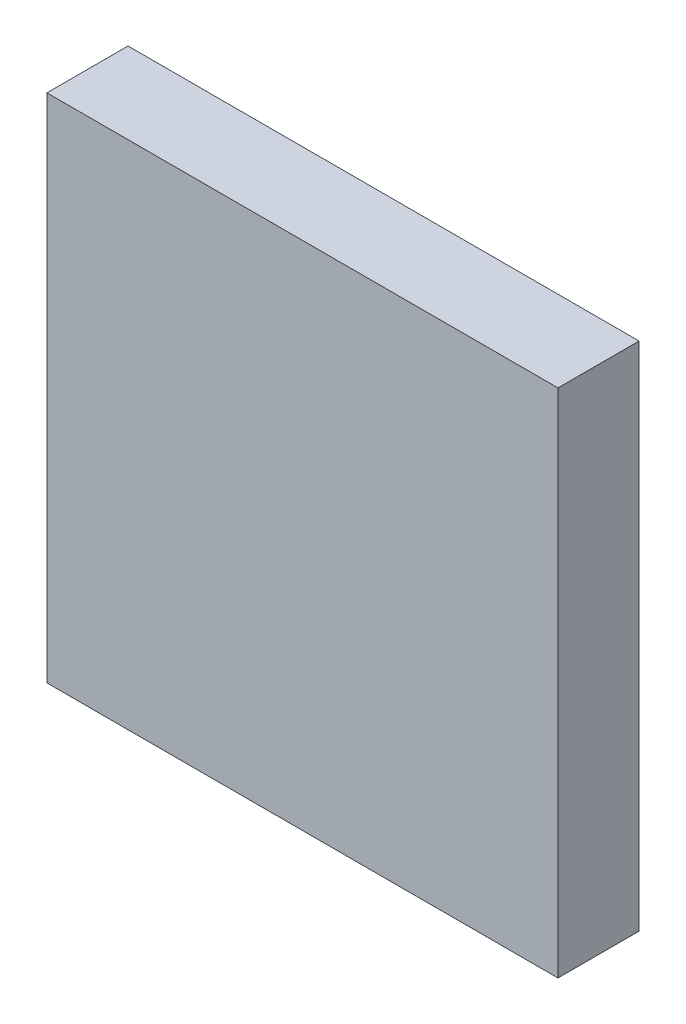
ISO-10303-21;
HEADER;
FILE_DESCRIPTION(('STEP AP214'),'2;1');
FILE_NAME('part.step','',(''),(''),'','','');
FILE_SCHEMA(('AUTOMOTIVE_DESIGN { 1 0 10303 214 1 1 1 1 }'));
ENDSEC;
DATA;
#1=APPLICATION_CONTEXT('core data for automotive mechanical design processes');
#2=APPLICATION_PROTOCOL_DEFINITION('international standard','automotive_design',2000,#1);
#3=PRODUCT_CONTEXT('',#1,'mechanical');
#4=PRODUCT('Part','Part','',(#3));
#5=PRODUCT_RELATED_PRODUCT_CATEGORY('part','',(#4));
#6=PRODUCT_DEFINITION_FORMATION('','',#4);
#7=PRODUCT_DEFINITION_CONTEXT('part definition',#1,'design');
#8=PRODUCT_DEFINITION('design','',#6,#7);
#9=PRODUCT_DEFINITION_SHAPE('','',#8);
#10=(LENGTH_UNIT() NAMED_UNIT(*) SI_UNIT(.MILLI.,.METRE.));
#11=(NAMED_UNIT(*) PLANE_ANGLE_UNIT() SI_UNIT($,.RADIAN.));
#12=(NAMED_UNIT(*) SI_UNIT($,.STERADIAN.) SOLID_ANGLE_UNIT());
#13=UNCERTAINTY_MEASURE_WITH_UNIT(LENGTH_MEASURE(1.E-05),#10,'distance_accuracy_value','');
#14=(GEOMETRIC_REPRESENTATION_CONTEXT(3) GLOBAL_UNCERTAINTY_ASSIGNED_CONTEXT((#13)) GLOBAL_UNIT_ASSIGNED_CONTEXT((#10,
#11,#12)) REPRESENTATION_CONTEXT('',''));
#15=CARTESIAN_POINT('',(0.,0.,0.));
#16=DIRECTION('',(0.,0.,1.));
#17=DIRECTION('',(1.,0.,0.));
#18=AXIS2_PLACEMENT_3D('',#15,#16,#17);
#19=CARTESIAN_POINT('',(0.,0.,3.175));
#20=DIRECTION('',(1.,0.,0.));
#21=DIRECTION('',(0.,0.,-1.));
#22=AXIS2_PLACEMENT_3D('',#19,#20,#21);
#23=PLANE('',#22);
#24=DIRECTION('',(0.,-1.,0.));
#25=VECTOR('',#24,1.);
#26=CARTESIAN_POINT('',(0.,0.,0.));
#27=LINE('',#26,#25);
#28=CARTESIAN_POINT('',(0.,20.,0.));
#29=VERTEX_POINT('',#28);
#30=CARTESIAN_POINT('',(0.,0.,0.));
#31=VERTEX_POINT('',#30);
#32=EDGE_CURVE('E96',#29,#31,#27,.T.);
#33=ORIENTED_EDGE('',*,*,#32,.T.);
#34=DIRECTION('',(0.,0.,-1.));
#35=VECTOR('',#34,1.);
#36=CARTESIAN_POINT('',(0.,0.,3.175));
#37=LINE('',#36,#35);
#38=CARTESIAN_POINT('',(0.,0.,3.175));
#39=VERTEX_POINT('',#38);
#40=EDGE_CURVE('E11',#39,#31,#37,.T.);
#41=ORIENTED_EDGE('',*,*,#40,.F.);
#42=DIRECTION('',(0.,-1.,0.));
#43=VECTOR('',#42,1.);
#44=CARTESIAN_POINT('',(0.,0.,3.175));
#45=LINE('',#44,#43);
#46=CARTESIAN_POINT('',(0.,20.,3.175));
#47=VERTEX_POINT('',#46);
#48=EDGE_CURVE('E84',#47,#39,#45,.T.);
#49=ORIENTED_EDGE('',*,*,#48,.F.);
#50=DIRECTION('',(0.,0.,-1.));
#51=VECTOR('',#50,1.);
#52=CARTESIAN_POINT('',(0.,20.,3.175));
#53=LINE('',#52,#51);
#54=EDGE_CURVE('E92',#47,#29,#53,.T.);
#55=ORIENTED_EDGE('',*,*,#54,.T.);
#56=EDGE_LOOP('',(#33,#41,#49,#55));
#57=FACE_BOUND('',#56,.T.);
#58=ADVANCED_FACE('F33',(#57),#23,.F.);
#59=CARTESIAN_POINT('',(0.,0.,3.175));
#60=DIRECTION('',(0.,1.,0.));
#61=DIRECTION('',(0.,0.,1.));
#62=AXIS2_PLACEMENT_3D('',#59,#60,#61);
#63=PLANE('',#62);
#64=DIRECTION('',(1.,0.,0.));
#65=VECTOR('',#64,1.);
#66=CARTESIAN_POINT('',(0.,0.,0.));
#67=LINE('',#66,#65);
#68=CARTESIAN_POINT('',(20.,0.,0.));
#69=VERTEX_POINT('',#68);
#70=EDGE_CURVE('E88',#31,#69,#67,.T.);
#71=ORIENTED_EDGE('',*,*,#70,.T.);
#72=DIRECTION('',(0.,0.,-1.));
#73=VECTOR('',#72,1.);
#74=CARTESIAN_POINT('',(20.,0.,3.175));
#75=LINE('',#74,#73);
#76=CARTESIAN_POINT('',(20.,0.,3.175));
#77=VERTEX_POINT('',#76);
#78=EDGE_CURVE('E41',#77,#69,#75,.T.);
#79=ORIENTED_EDGE('',*,*,#78,.F.);
#80=DIRECTION('',(1.,0.,0.));
#81=VECTOR('',#80,1.);
#82=CARTESIAN_POINT('',(0.,0.,3.175));
#83=LINE('',#82,#81);
#84=EDGE_CURVE('E79',#39,#77,#83,.T.);
#85=ORIENTED_EDGE('',*,*,#84,.F.);
#86=ORIENTED_EDGE('',*,*,#40,.T.);
#87=EDGE_LOOP('',(#71,#79,#85,#86));
#88=FACE_BOUND('',#87,.T.);
#89=ADVANCED_FACE('F87',(#88),#63,.F.);
#90=CARTESIAN_POINT('',(20.,0.,3.175));
#91=DIRECTION('',(-1.,0.,0.));
#92=DIRECTION('',(0.,0.,1.));
#93=AXIS2_PLACEMENT_3D('',#90,#91,#92);
#94=PLANE('',#93);
#95=DIRECTION('',(0.,1.,0.));
#96=VECTOR('',#95,1.);
#97=CARTESIAN_POINT('',(20.,0.,0.));
#98=LINE('',#97,#96);
#99=CARTESIAN_POINT('',(20.,20.,0.));
#100=VERTEX_POINT('',#99);
#101=EDGE_CURVE('E66',#69,#100,#98,.T.);
#102=ORIENTED_EDGE('',*,*,#101,.T.);
#103=DIRECTION('',(0.,0.,-1.));
#104=VECTOR('',#103,1.);
#105=CARTESIAN_POINT('',(20.,20.,3.175));
#106=LINE('',#105,#104);
#107=CARTESIAN_POINT('',(20.,20.,3.175));
#108=VERTEX_POINT('',#107);
#109=EDGE_CURVE('E89',#108,#100,#106,.T.);
#110=ORIENTED_EDGE('',*,*,#109,.F.);
#111=DIRECTION('',(0.,1.,0.));
#112=VECTOR('',#111,1.);
#113=CARTESIAN_POINT('',(20.,0.,3.175));
#114=LINE('',#113,#112);
#115=EDGE_CURVE('E82',#77,#108,#114,.T.);
#116=ORIENTED_EDGE('',*,*,#115,.F.);
#117=ORIENTED_EDGE('',*,*,#78,.T.);
#118=EDGE_LOOP('',(#102,#110,#116,#117));
#119=FACE_BOUND('',#118,.T.);
#120=ADVANCED_FACE('F90',(#119),#94,.F.);
#121=CARTESIAN_POINT('',(0.,20.,3.175));
#122=DIRECTION('',(0.,-1.,0.));
#123=DIRECTION('',(0.,0.,-1.));
#124=AXIS2_PLACEMENT_3D('',#121,#122,#123);
#125=PLANE('',#124);
#126=DIRECTION('',(-1.,0.,0.));
#127=VECTOR('',#126,1.);
#128=CARTESIAN_POINT('',(0.,20.,0.));
#129=LINE('',#128,#127);
#130=EDGE_CURVE('E72',#100,#29,#129,.T.);
#131=ORIENTED_EDGE('',*,*,#130,.T.);
#132=ORIENTED_EDGE('',*,*,#54,.F.);
#133=DIRECTION('',(-1.,0.,0.));
#134=VECTOR('',#133,1.);
#135=CARTESIAN_POINT('',(0.,20.,3.175));
#136=LINE('',#135,#134);
#137=EDGE_CURVE('E49',#108,#47,#136,.T.);
#138=ORIENTED_EDGE('',*,*,#137,.F.);
#139=ORIENTED_EDGE('',*,*,#109,.T.);
#140=EDGE_LOOP('',(#131,#132,#138,#139));
#141=FACE_BOUND('',#140,.T.);
#142=ADVANCED_FACE('F103',(#141),#125,.F.);
#143=CARTESIAN_POINT('',(0.,0.,3.175));
#144=DIRECTION('',(0.,0.,-1.));
#145=DIRECTION('',(-1.,0.,0.));
#146=AXIS2_PLACEMENT_3D('',#143,#144,#145);
#147=PLANE('',#146);
#148=ORIENTED_EDGE('',*,*,#48,.T.);
#149=ORIENTED_EDGE('',*,*,#84,.T.);
#150=ORIENTED_EDGE('',*,*,#115,.T.);
#151=ORIENTED_EDGE('',*,*,#137,.T.);
#152=EDGE_LOOP('',(#148,#149,#150,#151));
#153=FACE_BOUND('',#152,.T.);
#154=ADVANCED_FACE('F80',(#153),#147,.F.);
#155=CARTESIAN_POINT('',(0.,0.,0.));
#156=DIRECTION('',(0.,0.,-1.));
#157=DIRECTION('',(-1.,0.,0.));
#158=AXIS2_PLACEMENT_3D('',#155,#156,#157);
#159=PLANE('',#158);
#160=ORIENTED_EDGE('',*,*,#32,.F.);
#161=ORIENTED_EDGE('',*,*,#130,.F.);
#162=ORIENTED_EDGE('',*,*,#101,.F.);
#163=ORIENTED_EDGE('',*,*,#70,.F.);
#164=EDGE_LOOP('',(#160,#161,#162,#163));
#165=FACE_BOUND('',#164,.T.);
#166=ADVANCED_FACE('F106',(#165),#159,.T.);
#167=CLOSED_SHELL('',(#58,#89,#120,#142,#154,#166));
#168=MANIFOLD_SOLID_BREP('B2',#167);
#169=ADVANCED_BREP_SHAPE_REPRESENTATION('',(#18,#168),#14);
#170=SHAPE_DEFINITION_REPRESENTATION(#9,#169);
ENDSEC;
END-ISO-10303-21;
